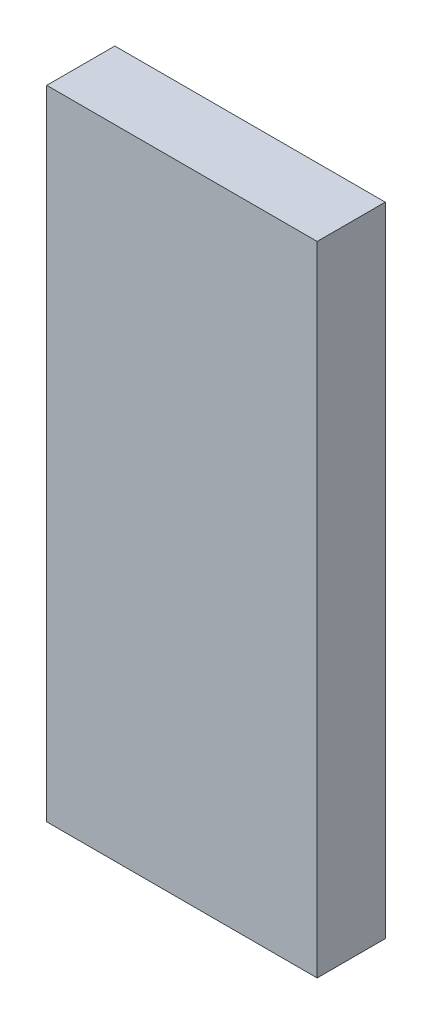
ISO-10303-21;
HEADER;
FILE_DESCRIPTION(('STEP AP214'),'2;1');
FILE_NAME('part.step','',(''),(''),'','','');
FILE_SCHEMA(('AUTOMOTIVE_DESIGN { 1 0 10303 214 1 1 1 1 }'));
ENDSEC;
DATA;
#1=APPLICATION_CONTEXT('core data for automotive mechanical design processes');
#2=APPLICATION_PROTOCOL_DEFINITION('international standard','automotive_design',2000,#1);
#3=PRODUCT_CONTEXT('',#1,'mechanical');
#4=PRODUCT('Part','Part','',(#3));
#5=PRODUCT_RELATED_PRODUCT_CATEGORY('part','',(#4));
#6=PRODUCT_DEFINITION_FORMATION('','',#4);
#7=PRODUCT_DEFINITION_CONTEXT('part definition',#1,'design');
#8=PRODUCT_DEFINITION('design','',#6,#7);
#9=PRODUCT_DEFINITION_SHAPE('','',#8);
#10=(LENGTH_UNIT() NAMED_UNIT(*) SI_UNIT(.MILLI.,.METRE.));
#11=(NAMED_UNIT(*) PLANE_ANGLE_UNIT() SI_UNIT($,.RADIAN.));
#12=(NAMED_UNIT(*) SI_UNIT($,.STERADIAN.) SOLID_ANGLE_UNIT());
#13=UNCERTAINTY_MEASURE_WITH_UNIT(LENGTH_MEASURE(1.E-05),#10,'distance_accuracy_value','');
#14=(GEOMETRIC_REPRESENTATION_CONTEXT(3) GLOBAL_UNCERTAINTY_ASSIGNED_CONTEXT((#13)) GLOBAL_UNIT_ASSIGNED_CONTEXT((#10,
#11,#12)) REPRESENTATION_CONTEXT('',''));
#15=CARTESIAN_POINT('',(0.,0.,0.));
#16=DIRECTION('',(0.,0.,1.));
#17=DIRECTION('',(1.,0.,0.));
#18=AXIS2_PLACEMENT_3D('',#15,#16,#17);
#19=CARTESIAN_POINT('',(0.67499992,-1.59229298,0.));
#20=DIRECTION('',(-1.,0.,0.));
#21=DIRECTION('',(0.,1.,0.));
#22=AXIS2_PLACEMENT_3D('',#19,#20,#21);
#23=PLANE('',#22);
#24=DIRECTION('',(0.,1.,0.));
#25=VECTOR('',#24,1.);
#26=CARTESIAN_POINT('',(0.67499992,-1.59229298,0.));
#27=LINE('',#26,#25);
#28=CARTESIAN_POINT('',(0.67499992,-1.59229298,0.));
#29=VERTEX_POINT('',#28);
#30=CARTESIAN_POINT('',(0.67499992,1.59229298,0.));
#31=VERTEX_POINT('',#30);
#32=EDGE_CURVE('E11',#29,#31,#27,.T.);
#33=ORIENTED_EDGE('',*,*,#32,.T.);
#34=DIRECTION('',(0.,0.,1.));
#35=VECTOR('',#34,1.);
#36=CARTESIAN_POINT('',(0.67499992,1.59229298,0.));
#37=LINE('',#36,#35);
#38=CARTESIAN_POINT('',(0.67499992,1.59229298,0.33999932));
#39=VERTEX_POINT('',#38);
#40=EDGE_CURVE('E24',#31,#39,#37,.T.);
#41=ORIENTED_EDGE('',*,*,#40,.T.);
#42=DIRECTION('',(0.,1.,0.));
#43=VECTOR('',#42,1.);
#44=CARTESIAN_POINT('',(0.67499992,-1.59229298,0.33999932));
#45=LINE('',#44,#43);
#46=CARTESIAN_POINT('',(0.67499992,-1.59229298,0.33999932));
#47=VERTEX_POINT('',#46);
#48=EDGE_CURVE('E87',#47,#39,#45,.T.);
#49=ORIENTED_EDGE('',*,*,#48,.F.);
#50=DIRECTION('',(0.,0.,1.));
#51=VECTOR('',#50,1.);
#52=CARTESIAN_POINT('',(0.67499992,-1.59229298,0.));
#53=LINE('',#52,#51);
#54=EDGE_CURVE('E36',#29,#47,#53,.T.);
#55=ORIENTED_EDGE('',*,*,#54,.F.);
#56=EDGE_LOOP('',(#33,#41,#49,#55));
#57=FACE_BOUND('',#56,.T.);
#58=ADVANCED_FACE('F17',(#57),#23,.F.);
#59=CARTESIAN_POINT('',(0.67499992,1.59229298,0.));
#60=DIRECTION('',(0.,-1.,0.));
#61=DIRECTION('',(-1.,0.,0.));
#62=AXIS2_PLACEMENT_3D('',#59,#60,#61);
#63=PLANE('',#62);
#64=DIRECTION('',(-1.,0.,0.));
#65=VECTOR('',#64,1.);
#66=CARTESIAN_POINT('',(0.67499992,1.59229298,0.));
#67=LINE('',#66,#65);
#68=CARTESIAN_POINT('',(-0.67499992,1.59229298,0.));
#69=VERTEX_POINT('',#68);
#70=EDGE_CURVE('E84',#31,#69,#67,.T.);
#71=ORIENTED_EDGE('',*,*,#70,.T.);
#72=DIRECTION('',(0.,0.,1.));
#73=VECTOR('',#72,1.);
#74=CARTESIAN_POINT('',(-0.67499992,1.59229298,0.));
#75=LINE('',#74,#73);
#76=CARTESIAN_POINT('',(-0.67499992,1.59229298,0.33999932));
#77=VERTEX_POINT('',#76);
#78=EDGE_CURVE('E82',#69,#77,#75,.T.);
#79=ORIENTED_EDGE('',*,*,#78,.T.);
#80=DIRECTION('',(-1.,0.,0.));
#81=VECTOR('',#80,1.);
#82=CARTESIAN_POINT('',(0.67499992,1.59229298,0.33999932));
#83=LINE('',#82,#81);
#84=EDGE_CURVE('E62',#39,#77,#83,.T.);
#85=ORIENTED_EDGE('',*,*,#84,.F.);
#86=ORIENTED_EDGE('',*,*,#40,.F.);
#87=EDGE_LOOP('',(#71,#79,#85,#86));
#88=FACE_BOUND('',#87,.T.);
#89=ADVANCED_FACE('F89',(#88),#63,.F.);
#90=CARTESIAN_POINT('',(-0.67499992,1.59229298,0.));
#91=DIRECTION('',(1.,0.,0.));
#92=DIRECTION('',(0.,-1.,0.));
#93=AXIS2_PLACEMENT_3D('',#90,#91,#92);
#94=PLANE('',#93);
#95=DIRECTION('',(0.,-1.,0.));
#96=VECTOR('',#95,1.);
#97=CARTESIAN_POINT('',(-0.67499992,1.59229298,0.));
#98=LINE('',#97,#96);
#99=CARTESIAN_POINT('',(-0.67499992,-1.59229298,0.));
#100=VERTEX_POINT('',#99);
#101=EDGE_CURVE('E71',#69,#100,#98,.T.);
#102=ORIENTED_EDGE('',*,*,#101,.T.);
#103=DIRECTION('',(0.,0.,1.));
#104=VECTOR('',#103,1.);
#105=CARTESIAN_POINT('',(-0.67499992,-1.59229298,0.));
#106=LINE('',#105,#104);
#107=CARTESIAN_POINT('',(-0.67499992,-1.59229298,0.33999932));
#108=VERTEX_POINT('',#107);
#109=EDGE_CURVE('E65',#100,#108,#106,.T.);
#110=ORIENTED_EDGE('',*,*,#109,.T.);
#111=DIRECTION('',(0.,-1.,0.));
#112=VECTOR('',#111,1.);
#113=CARTESIAN_POINT('',(-0.67499992,1.59229298,0.33999932));
#114=LINE('',#113,#112);
#115=EDGE_CURVE('E57',#77,#108,#114,.T.);
#116=ORIENTED_EDGE('',*,*,#115,.F.);
#117=ORIENTED_EDGE('',*,*,#78,.F.);
#118=EDGE_LOOP('',(#102,#110,#116,#117));
#119=FACE_BOUND('',#118,.T.);
#120=ADVANCED_FACE('F69',(#119),#94,.F.);
#121=CARTESIAN_POINT('',(-0.67499992,-1.59229298,0.));
#122=DIRECTION('',(0.,1.,0.));
#123=DIRECTION('',(1.,0.,0.));
#124=AXIS2_PLACEMENT_3D('',#121,#122,#123);
#125=PLANE('',#124);
#126=DIRECTION('',(1.,0.,0.));
#127=VECTOR('',#126,1.);
#128=CARTESIAN_POINT('',(-0.67499992,-1.59229298,0.));
#129=LINE('',#128,#127);
#130=EDGE_CURVE('E66',#100,#29,#129,.T.);
#131=ORIENTED_EDGE('',*,*,#130,.T.);
#132=ORIENTED_EDGE('',*,*,#54,.T.);
#133=DIRECTION('',(1.,0.,0.));
#134=VECTOR('',#133,1.);
#135=CARTESIAN_POINT('',(-0.67499992,-1.59229298,0.33999932));
#136=LINE('',#135,#134);
#137=EDGE_CURVE('E61',#108,#47,#136,.T.);
#138=ORIENTED_EDGE('',*,*,#137,.F.);
#139=ORIENTED_EDGE('',*,*,#109,.F.);
#140=EDGE_LOOP('',(#131,#132,#138,#139));
#141=FACE_BOUND('',#140,.T.);
#142=ADVANCED_FACE('F76',(#141),#125,.F.);
#143=CARTESIAN_POINT('',(0.,0.,0.));
#144=DIRECTION('',(0.,0.,1.));
#145=DIRECTION('',(1.,0.,0.));
#146=AXIS2_PLACEMENT_3D('',#143,#144,#145);
#147=PLANE('',#146);
#148=ORIENTED_EDGE('',*,*,#130,.F.);
#149=ORIENTED_EDGE('',*,*,#101,.F.);
#150=ORIENTED_EDGE('',*,*,#70,.F.);
#151=ORIENTED_EDGE('',*,*,#32,.F.);
#152=EDGE_LOOP('',(#148,#149,#150,#151));
#153=FACE_BOUND('',#152,.T.);
#154=ADVANCED_FACE('F91',(#153),#147,.F.);
#155=CARTESIAN_POINT('',(0.,0.,0.33999932));
#156=DIRECTION('',(0.,0.,1.));
#157=DIRECTION('',(1.,0.,0.));
#158=AXIS2_PLACEMENT_3D('',#155,#156,#157);
#159=PLANE('',#158);
#160=ORIENTED_EDGE('',*,*,#48,.T.);
#161=ORIENTED_EDGE('',*,*,#84,.T.);
#162=ORIENTED_EDGE('',*,*,#115,.T.);
#163=ORIENTED_EDGE('',*,*,#137,.T.);
#164=EDGE_LOOP('',(#160,#161,#162,#163));
#165=FACE_BOUND('',#164,.T.);
#166=ADVANCED_FACE('F59',(#165),#159,.T.);
#167=CLOSED_SHELL('',(#58,#89,#120,#142,#154,#166));
#168=MANIFOLD_SOLID_BREP('B1',#167);
#169=ADVANCED_BREP_SHAPE_REPRESENTATION('',(#18,#168),#14);
#170=SHAPE_DEFINITION_REPRESENTATION(#9,#169);
ENDSEC;
END-ISO-10303-21;
